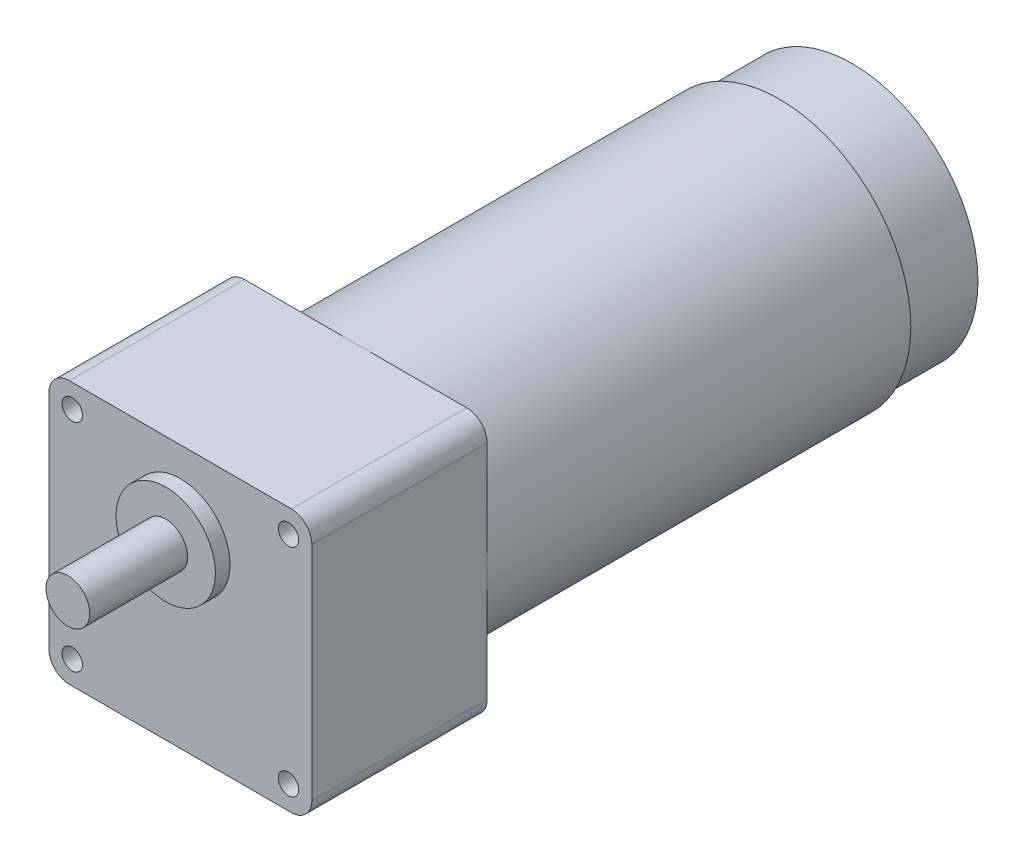
ISO-10303-21;
HEADER;
FILE_DESCRIPTION(('STEP AP214'),'2;1');
FILE_NAME('part.step','',(''),(''),'','','');
FILE_SCHEMA(('AUTOMOTIVE_DESIGN { 1 0 10303 214 1 1 1 1 }'));
ENDSEC;
DATA;
#1=APPLICATION_CONTEXT('core data for automotive mechanical design processes');
#2=APPLICATION_PROTOCOL_DEFINITION('international standard','automotive_design',2000,#1);
#3=PRODUCT_CONTEXT('',#1,'mechanical');
#4=PRODUCT('Part','Part','',(#3));
#5=PRODUCT_RELATED_PRODUCT_CATEGORY('part','',(#4));
#6=PRODUCT_DEFINITION_FORMATION('','',#4);
#7=PRODUCT_DEFINITION_CONTEXT('part definition',#1,'design');
#8=PRODUCT_DEFINITION('design','',#6,#7);
#9=PRODUCT_DEFINITION_SHAPE('','',#8);
#10=(LENGTH_UNIT() NAMED_UNIT(*) SI_UNIT(.MILLI.,.METRE.));
#11=(NAMED_UNIT(*) PLANE_ANGLE_UNIT() SI_UNIT($,.RADIAN.));
#12=(NAMED_UNIT(*) SI_UNIT($,.STERADIAN.) SOLID_ANGLE_UNIT());
#13=UNCERTAINTY_MEASURE_WITH_UNIT(LENGTH_MEASURE(1.E-05),#10,'distance_accuracy_value','');
#14=(GEOMETRIC_REPRESENTATION_CONTEXT(3) GLOBAL_UNCERTAINTY_ASSIGNED_CONTEXT((#13)) GLOBAL_UNIT_ASSIGNED_CONTEXT((#10,
#11,#12)) REPRESENTATION_CONTEXT('',''));
#15=CARTESIAN_POINT('',(0.,0.,0.));
#16=DIRECTION('',(0.,0.,1.));
#17=DIRECTION('',(1.,0.,0.));
#18=AXIS2_PLACEMENT_3D('',#15,#16,#17);
#19=CARTESIAN_POINT('',(0.,0.,-170.));
#20=DIRECTION('',(0.,0.,1.));
#21=DIRECTION('',(1.,0.,0.));
#22=AXIS2_PLACEMENT_3D('',#19,#20,#21);
#23=CYLINDRICAL_SURFACE('',#22,45.);
#24=CARTESIAN_POINT('',(0.,0.,0.));
#25=DIRECTION('',(0.,0.,-1.));
#26=DIRECTION('',(-1.,0.,0.));
#27=AXIS2_PLACEMENT_3D('',#24,#25,#26);
#28=CIRCLE('',#27,45.);
#29=CARTESIAN_POINT('',(-45.,0.,0.));
#30=VERTEX_POINT('',#29);
#31=CARTESIAN_POINT('',(0.,45.,0.));
#32=VERTEX_POINT('',#31);
#33=EDGE_CURVE('E129',#30,#32,#28,.T.);
#34=ORIENTED_EDGE('',*,*,#33,.T.);
#35=CARTESIAN_POINT('',(45.,0.,0.));
#36=VERTEX_POINT('',#35);
#37=EDGE_CURVE('E138',#32,#36,#28,.T.);
#38=ORIENTED_EDGE('',*,*,#37,.T.);
#39=CARTESIAN_POINT('',(0.,-45.,0.));
#40=VERTEX_POINT('',#39);
#41=EDGE_CURVE('E142',#36,#40,#28,.T.);
#42=ORIENTED_EDGE('',*,*,#41,.T.);
#43=EDGE_CURVE('E124',#40,#30,#28,.T.);
#44=ORIENTED_EDGE('',*,*,#43,.T.);
#45=EDGE_LOOP('',(#34,#38,#42,#44));
#46=FACE_BOUND('',#45,.T.);
#47=CARTESIAN_POINT('',(0.,0.,-145.));
#48=DIRECTION('',(0.,0.,-1.));
#49=DIRECTION('',(-1.,0.,0.));
#50=AXIS2_PLACEMENT_3D('',#47,#48,#49);
#51=CIRCLE('',#50,45.);
#52=CARTESIAN_POINT('',(-45.,0.,-145.));
#53=VERTEX_POINT('',#52);
#54=EDGE_CURVE('E494',#53,#53,#51,.T.);
#55=ORIENTED_EDGE('',*,*,#54,.F.);
#56=EDGE_LOOP('',(#55));
#57=FACE_BOUND('',#56,.T.);
#58=ADVANCED_FACE('F35',(#46,#57),#23,.T.);
#59=CARTESIAN_POINT('',(0.,0.,0.));
#60=DIRECTION('',(0.,0.,1.));
#61=DIRECTION('',(1.,0.,0.));
#62=AXIS2_PLACEMENT_3D('',#59,#60,#61);
#63=PLANE('',#62);
#64=CARTESIAN_POINT('',(-37.,37.,0.));
#65=DIRECTION('',(0.,0.,1.));
#66=DIRECTION('',(1.,0.,0.));
#67=AXIS2_PLACEMENT_3D('',#64,#65,#66);
#68=CIRCLE('',#67,3.5);
#69=CARTESIAN_POINT('',(-33.5,37.,0.));
#70=VERTEX_POINT('',#69);
#71=EDGE_CURVE('E520',#70,#70,#68,.F.);
#72=ORIENTED_EDGE('',*,*,#71,.F.);
#73=EDGE_LOOP('',(#72));
#74=FACE_BOUND('',#73,.T.);
#75=DIRECTION('',(0.,-1.,0.));
#76=VECTOR('',#75,1.);
#77=CARTESIAN_POINT('',(-45.,45.,0.));
#78=LINE('',#77,#76);
#79=CARTESIAN_POINT('',(-45.,38.,0.));
#80=VERTEX_POINT('',#79);
#81=EDGE_CURVE('E111',#80,#30,#78,.T.);
#82=ORIENTED_EDGE('',*,*,#81,.F.);
#83=CARTESIAN_POINT('',(-38.,38.,0.));
#84=DIRECTION('',(0.,0.,1.));
#85=DIRECTION('',(1.,0.,0.));
#86=AXIS2_PLACEMENT_3D('',#83,#84,#85);
#87=CIRCLE('',#86,7.);
#88=CARTESIAN_POINT('',(-38.,45.,0.));
#89=VERTEX_POINT('',#88);
#90=EDGE_CURVE('E11',#80,#89,#87,.F.);
#91=ORIENTED_EDGE('',*,*,#90,.T.);
#92=DIRECTION('',(-1.,0.,0.));
#93=VECTOR('',#92,1.);
#94=CARTESIAN_POINT('',(-45.,45.,0.));
#95=LINE('',#94,#93);
#96=EDGE_CURVE('E132',#32,#89,#95,.T.);
#97=ORIENTED_EDGE('',*,*,#96,.F.);
#98=ORIENTED_EDGE('',*,*,#33,.F.);
#99=EDGE_LOOP('',(#82,#91,#97,#98));
#100=FACE_BOUND('',#99,.T.);
#101=ADVANCED_FACE('F130',(#74,#100),#63,.F.);
#102=CARTESIAN_POINT('',(37.,37.0000000000021,0.));
#103=DIRECTION('',(0.,0.,1.));
#104=DIRECTION('',(1.,0.,0.));
#105=AXIS2_PLACEMENT_3D('',#102,#103,#104);
#106=CIRCLE('',#105,3.5);
#107=CARTESIAN_POINT('',(40.5,37.0000000000021,0.));
#108=VERTEX_POINT('',#107);
#109=EDGE_CURVE('E503',#108,#108,#106,.F.);
#110=ORIENTED_EDGE('',*,*,#109,.F.);
#111=EDGE_LOOP('',(#110));
#112=FACE_BOUND('',#111,.T.);
#113=CARTESIAN_POINT('',(37.9999999999999,45.,0.));
#114=VERTEX_POINT('',#113);
#115=EDGE_CURVE('E126',#114,#32,#95,.T.);
#116=ORIENTED_EDGE('',*,*,#115,.F.);
#117=CARTESIAN_POINT('',(38.,38.,0.));
#118=DIRECTION('',(0.,0.,1.));
#119=DIRECTION('',(1.,0.,0.));
#120=AXIS2_PLACEMENT_3D('',#117,#118,#119);
#121=CIRCLE('',#120,7.);
#122=CARTESIAN_POINT('',(45.,38.,0.));
#123=VERTEX_POINT('',#122);
#124=EDGE_CURVE('E189',#114,#123,#121,.F.);
#125=ORIENTED_EDGE('',*,*,#124,.T.);
#126=DIRECTION('',(0.,1.,0.));
#127=VECTOR('',#126,1.);
#128=CARTESIAN_POINT('',(45.,45.,0.));
#129=LINE('',#128,#127);
#130=EDGE_CURVE('E135',#36,#123,#129,.T.);
#131=ORIENTED_EDGE('',*,*,#130,.F.);
#132=ORIENTED_EDGE('',*,*,#37,.F.);
#133=EDGE_LOOP('',(#116,#125,#131,#132));
#134=FACE_BOUND('',#133,.T.);
#135=ADVANCED_FACE('F219',(#112,#134),#63,.F.);
#136=CARTESIAN_POINT('',(37.0000000000021,-36.9999999999979,0.));
#137=DIRECTION('',(0.,0.,1.));
#138=DIRECTION('',(1.,0.,0.));
#139=AXIS2_PLACEMENT_3D('',#136,#137,#138);
#140=CIRCLE('',#139,3.5);
#141=CARTESIAN_POINT('',(40.5000000000021,-36.9999999999979,0.));
#142=VERTEX_POINT('',#141);
#143=EDGE_CURVE('E504',#142,#142,#140,.F.);
#144=ORIENTED_EDGE('',*,*,#143,.F.);
#145=EDGE_LOOP('',(#144));
#146=FACE_BOUND('',#145,.T.);
#147=CARTESIAN_POINT('',(45.,-38.,0.));
#148=VERTEX_POINT('',#147);
#149=EDGE_CURVE('E160',#148,#36,#129,.T.);
#150=ORIENTED_EDGE('',*,*,#149,.F.);
#151=CARTESIAN_POINT('',(38.,-38.,0.));
#152=DIRECTION('',(0.,0.,1.));
#153=DIRECTION('',(1.,0.,0.));
#154=AXIS2_PLACEMENT_3D('',#151,#152,#153);
#155=CIRCLE('',#154,7.);
#156=CARTESIAN_POINT('',(38.,-45.,0.));
#157=VERTEX_POINT('',#156);
#158=EDGE_CURVE('E169',#148,#157,#155,.F.);
#159=ORIENTED_EDGE('',*,*,#158,.T.);
#160=DIRECTION('',(1.,0.,0.));
#161=VECTOR('',#160,1.);
#162=CARTESIAN_POINT('',(-45.,-45.,0.));
#163=LINE('',#162,#161);
#164=EDGE_CURVE('E119',#40,#157,#163,.T.);
#165=ORIENTED_EDGE('',*,*,#164,.F.);
#166=ORIENTED_EDGE('',*,*,#41,.F.);
#167=EDGE_LOOP('',(#150,#159,#165,#166));
#168=FACE_BOUND('',#167,.T.);
#169=ADVANCED_FACE('F214',(#146,#168),#63,.F.);
#170=CARTESIAN_POINT('',(45.,45.,60.));
#171=DIRECTION('',(-1.,0.,0.));
#172=DIRECTION('',(0.,-1.,0.));
#173=AXIS2_PLACEMENT_3D('',#170,#171,#172);
#174=PLANE('',#173);
#175=DIRECTION('',(0.,1.,0.));
#176=VECTOR('',#175,1.);
#177=CARTESIAN_POINT('',(45.,45.,60.));
#178=LINE('',#177,#176);
#179=CARTESIAN_POINT('',(45.,-38.,60.));
#180=VERTEX_POINT('',#179);
#181=CARTESIAN_POINT('',(45.,38.,60.));
#182=VERTEX_POINT('',#181);
#183=EDGE_CURVE('E151',#180,#182,#178,.T.);
#184=ORIENTED_EDGE('',*,*,#183,.F.);
#185=DIRECTION('',(0.,0.,-1.));
#186=VECTOR('',#185,1.);
#187=CARTESIAN_POINT('',(45.,-38.,60.));
#188=LINE('',#187,#186);
#189=EDGE_CURVE('E166',#180,#148,#188,.T.);
#190=ORIENTED_EDGE('',*,*,#189,.T.);
#191=ORIENTED_EDGE('',*,*,#149,.T.);
#192=ORIENTED_EDGE('',*,*,#130,.T.);
#193=DIRECTION('',(0.,0.,-1.));
#194=VECTOR('',#193,1.);
#195=CARTESIAN_POINT('',(45.,38.,60.));
#196=LINE('',#195,#194);
#197=EDGE_CURVE('E164',#123,#182,#196,.F.);
#198=ORIENTED_EDGE('',*,*,#197,.T.);
#199=EDGE_LOOP('',(#184,#190,#191,#192,#198));
#200=FACE_BOUND('',#199,.T.);
#201=ADVANCED_FACE('F211',(#200),#174,.F.);
#202=CARTESIAN_POINT('',(-45.,45.,60.));
#203=DIRECTION('',(0.,-1.,0.));
#204=DIRECTION('',(0.,0.,-1.));
#205=AXIS2_PLACEMENT_3D('',#202,#203,#204);
#206=PLANE('',#205);
#207=DIRECTION('',(-1.,0.,0.));
#208=VECTOR('',#207,1.);
#209=CARTESIAN_POINT('',(-45.,45.,60.));
#210=LINE('',#209,#208);
#211=CARTESIAN_POINT('',(37.9999999999999,45.,60.));
#212=VERTEX_POINT('',#211);
#213=CARTESIAN_POINT('',(-38.,45.,60.));
#214=VERTEX_POINT('',#213);
#215=EDGE_CURVE('E154',#212,#214,#210,.T.);
#216=ORIENTED_EDGE('',*,*,#215,.F.);
#217=DIRECTION('',(0.,0.,-1.));
#218=VECTOR('',#217,1.);
#219=CARTESIAN_POINT('',(38.,45.,60.));
#220=LINE('',#219,#218);
#221=EDGE_CURVE('E186',#212,#114,#220,.T.);
#222=ORIENTED_EDGE('',*,*,#221,.T.);
#223=ORIENTED_EDGE('',*,*,#115,.T.);
#224=ORIENTED_EDGE('',*,*,#96,.T.);
#225=DIRECTION('',(0.,0.,-1.));
#226=VECTOR('',#225,1.);
#227=CARTESIAN_POINT('',(-38.,45.,60.));
#228=LINE('',#227,#226);
#229=EDGE_CURVE('E184',#89,#214,#228,.F.);
#230=ORIENTED_EDGE('',*,*,#229,.T.);
#231=EDGE_LOOP('',(#216,#222,#223,#224,#230));
#232=FACE_BOUND('',#231,.T.);
#233=ADVANCED_FACE('F227',(#232),#206,.F.);
#234=CARTESIAN_POINT('',(-45.,45.,60.));
#235=DIRECTION('',(1.,0.,0.));
#236=DIRECTION('',(0.,1.,0.));
#237=AXIS2_PLACEMENT_3D('',#234,#235,#236);
#238=PLANE('',#237);
#239=CARTESIAN_POINT('',(-45.,-38.,0.));
#240=VERTEX_POINT('',#239);
#241=EDGE_CURVE('E113',#30,#240,#78,.T.);
#242=ORIENTED_EDGE('',*,*,#241,.T.);
#243=DIRECTION('',(0.,0.,-1.));
#244=VECTOR('',#243,1.);
#245=CARTESIAN_POINT('',(-45.,-38.,60.));
#246=LINE('',#245,#244);
#247=CARTESIAN_POINT('',(-45.,-38.,60.));
#248=VERTEX_POINT('',#247);
#249=EDGE_CURVE('E43',#240,#248,#246,.F.);
#250=ORIENTED_EDGE('',*,*,#249,.T.);
#251=DIRECTION('',(0.,-1.,0.));
#252=VECTOR('',#251,1.);
#253=CARTESIAN_POINT('',(-45.,45.,60.));
#254=LINE('',#253,#252);
#255=CARTESIAN_POINT('',(-45.,38.,60.));
#256=VERTEX_POINT('',#255);
#257=EDGE_CURVE('E145',#256,#248,#254,.T.);
#258=ORIENTED_EDGE('',*,*,#257,.F.);
#259=DIRECTION('',(0.,0.,-1.));
#260=VECTOR('',#259,1.);
#261=CARTESIAN_POINT('',(-45.,38.,60.));
#262=LINE('',#261,#260);
#263=EDGE_CURVE('E116',#256,#80,#262,.T.);
#264=ORIENTED_EDGE('',*,*,#263,.T.);
#265=ORIENTED_EDGE('',*,*,#81,.T.);
#266=EDGE_LOOP('',(#242,#250,#258,#264,#265));
#267=FACE_BOUND('',#266,.T.);
#268=ADVANCED_FACE('F112',(#267),#238,.F.);
#269=CARTESIAN_POINT('',(-45.,-45.,60.));
#270=DIRECTION('',(0.,1.,0.));
#271=DIRECTION('',(0.,0.,1.));
#272=AXIS2_PLACEMENT_3D('',#269,#270,#271);
#273=PLANE('',#272);
#274=ORIENTED_EDGE('',*,*,#164,.T.);
#275=DIRECTION('',(0.,0.,-1.));
#276=VECTOR('',#275,1.);
#277=CARTESIAN_POINT('',(38.,-45.,60.));
#278=LINE('',#277,#276);
#279=CARTESIAN_POINT('',(38.,-45.,60.));
#280=VERTEX_POINT('',#279);
#281=EDGE_CURVE('E174',#157,#280,#278,.F.);
#282=ORIENTED_EDGE('',*,*,#281,.T.);
#283=DIRECTION('',(1.,0.,0.));
#284=VECTOR('',#283,1.);
#285=CARTESIAN_POINT('',(-45.,-45.,60.));
#286=LINE('',#285,#284);
#287=CARTESIAN_POINT('',(-38.,-45.,60.));
#288=VERTEX_POINT('',#287);
#289=EDGE_CURVE('E143',#288,#280,#286,.T.);
#290=ORIENTED_EDGE('',*,*,#289,.F.);
#291=DIRECTION('',(0.,0.,-1.));
#292=VECTOR('',#291,1.);
#293=CARTESIAN_POINT('',(-38.,-45.,60.));
#294=LINE('',#293,#292);
#295=CARTESIAN_POINT('',(-38.,-45.,0.));
#296=VERTEX_POINT('',#295);
#297=EDGE_CURVE('E171',#288,#296,#294,.T.);
#298=ORIENTED_EDGE('',*,*,#297,.T.);
#299=EDGE_CURVE('E155',#296,#40,#163,.T.);
#300=ORIENTED_EDGE('',*,*,#299,.T.);
#301=EDGE_LOOP('',(#274,#282,#290,#298,#300));
#302=FACE_BOUND('',#301,.T.);
#303=ADVANCED_FACE('F202',(#302),#273,.F.);
#304=CARTESIAN_POINT('',(0.,0.,60.));
#305=DIRECTION('',(0.,0.,1.));
#306=DIRECTION('',(1.,0.,0.));
#307=AXIS2_PLACEMENT_3D('',#304,#305,#306);
#308=PLANE('',#307);
#309=CARTESIAN_POINT('',(37.,37.0000000000021,60.));
#310=DIRECTION('',(0.,0.,1.));
#311=DIRECTION('',(1.,0.,0.));
#312=AXIS2_PLACEMENT_3D('',#309,#310,#311);
#313=CIRCLE('',#312,3.5);
#314=CARTESIAN_POINT('',(40.5,37.0000000000021,60.));
#315=VERTEX_POINT('',#314);
#316=EDGE_CURVE('E500',#315,#315,#313,.T.);
#317=ORIENTED_EDGE('',*,*,#316,.F.);
#318=EDGE_LOOP('',(#317));
#319=FACE_BOUND('',#318,.T.);
#320=CARTESIAN_POINT('',(37.0000000000021,-36.9999999999979,60.));
#321=DIRECTION('',(0.,0.,1.));
#322=DIRECTION('',(1.,0.,0.));
#323=AXIS2_PLACEMENT_3D('',#320,#321,#322);
#324=CIRCLE('',#323,3.5);
#325=CARTESIAN_POINT('',(40.5000000000021,-36.9999999999979,60.));
#326=VERTEX_POINT('',#325);
#327=EDGE_CURVE('E508',#326,#326,#324,.T.);
#328=ORIENTED_EDGE('',*,*,#327,.F.);
#329=EDGE_LOOP('',(#328));
#330=FACE_BOUND('',#329,.T.);
#331=CARTESIAN_POINT('',(-36.9999999999979,-37.,60.));
#332=DIRECTION('',(0.,0.,1.));
#333=DIRECTION('',(1.,0.,0.));
#334=AXIS2_PLACEMENT_3D('',#331,#332,#333);
#335=CIRCLE('',#334,3.5);
#336=CARTESIAN_POINT('',(-33.4999999999979,-37.,60.));
#337=VERTEX_POINT('',#336);
#338=EDGE_CURVE('E499',#337,#337,#335,.T.);
#339=ORIENTED_EDGE('',*,*,#338,.F.);
#340=EDGE_LOOP('',(#339));
#341=FACE_BOUND('',#340,.T.);
#342=CARTESIAN_POINT('',(-37.,37.,60.));
#343=DIRECTION('',(0.,0.,1.));
#344=DIRECTION('',(1.,0.,0.));
#345=AXIS2_PLACEMENT_3D('',#342,#343,#344);
#346=CIRCLE('',#345,3.5);
#347=CARTESIAN_POINT('',(-33.5,37.,60.));
#348=VERTEX_POINT('',#347);
#349=EDGE_CURVE('E507',#348,#348,#346,.T.);
#350=ORIENTED_EDGE('',*,*,#349,.F.);
#351=EDGE_LOOP('',(#350));
#352=FACE_BOUND('',#351,.T.);
#353=CARTESIAN_POINT('',(0.,18.,60.));
#354=DIRECTION('',(0.,0.,1.));
#355=DIRECTION('',(1.,0.,0.));
#356=AXIS2_PLACEMENT_3D('',#353,#354,#355);
#357=CIRCLE('',#356,17.);
#358=CARTESIAN_POINT('',(17.,18.,60.));
#359=VERTEX_POINT('',#358);
#360=EDGE_CURVE('E149',#359,#359,#357,.T.);
#361=ORIENTED_EDGE('',*,*,#360,.F.);
#362=EDGE_LOOP('',(#361));
#363=FACE_BOUND('',#362,.T.);
#364=ORIENTED_EDGE('',*,*,#289,.T.);
#365=CARTESIAN_POINT('',(38.,-38.,60.));
#366=DIRECTION('',(0.,0.,1.));
#367=DIRECTION('',(1.,0.,0.));
#368=AXIS2_PLACEMENT_3D('',#365,#366,#367);
#369=CIRCLE('',#368,7.);
#370=EDGE_CURVE('E182',#280,#180,#369,.T.);
#371=ORIENTED_EDGE('',*,*,#370,.T.);
#372=ORIENTED_EDGE('',*,*,#183,.T.);
#373=CARTESIAN_POINT('',(38.,38.,60.));
#374=DIRECTION('',(0.,0.,1.));
#375=DIRECTION('',(1.,0.,0.));
#376=AXIS2_PLACEMENT_3D('',#373,#374,#375);
#377=CIRCLE('',#376,7.);
#378=EDGE_CURVE('E180',#182,#212,#377,.T.);
#379=ORIENTED_EDGE('',*,*,#378,.T.);
#380=ORIENTED_EDGE('',*,*,#215,.T.);
#381=CARTESIAN_POINT('',(-38.,38.,60.));
#382=DIRECTION('',(0.,0.,1.));
#383=DIRECTION('',(1.,0.,0.));
#384=AXIS2_PLACEMENT_3D('',#381,#382,#383);
#385=CIRCLE('',#384,7.);
#386=EDGE_CURVE('E176',#214,#256,#385,.T.);
#387=ORIENTED_EDGE('',*,*,#386,.T.);
#388=ORIENTED_EDGE('',*,*,#257,.T.);
#389=CARTESIAN_POINT('',(-38.,-38.,60.));
#390=DIRECTION('',(0.,0.,1.));
#391=DIRECTION('',(1.,0.,0.));
#392=AXIS2_PLACEMENT_3D('',#389,#390,#391);
#393=CIRCLE('',#392,7.);
#394=EDGE_CURVE('E178',#248,#288,#393,.T.);
#395=ORIENTED_EDGE('',*,*,#394,.T.);
#396=EDGE_LOOP('',(#364,#371,#372,#379,#380,#387,#388,#395));
#397=FACE_BOUND('',#396,.T.);
#398=ADVANCED_FACE('F195',(#319,#330,#341,#352,#363,#397),#308,.T.);
#399=CARTESIAN_POINT('',(-36.9999999999979,-37.,0.));
#400=DIRECTION('',(0.,0.,1.));
#401=DIRECTION('',(1.,0.,0.));
#402=AXIS2_PLACEMENT_3D('',#399,#400,#401);
#403=CIRCLE('',#402,3.5);
#404=CARTESIAN_POINT('',(-33.4999999999979,-37.,0.));
#405=VERTEX_POINT('',#404);
#406=EDGE_CURVE('E511',#405,#405,#403,.F.);
#407=ORIENTED_EDGE('',*,*,#406,.F.);
#408=EDGE_LOOP('',(#407));
#409=FACE_BOUND('',#408,.T.);
#410=ORIENTED_EDGE('',*,*,#299,.F.);
#411=CARTESIAN_POINT('',(-38.,-38.,0.));
#412=DIRECTION('',(0.,0.,1.));
#413=DIRECTION('',(1.,0.,0.));
#414=AXIS2_PLACEMENT_3D('',#411,#412,#413);
#415=CIRCLE('',#414,7.);
#416=EDGE_CURVE('E56',#296,#240,#415,.F.);
#417=ORIENTED_EDGE('',*,*,#416,.T.);
#418=ORIENTED_EDGE('',*,*,#241,.F.);
#419=ORIENTED_EDGE('',*,*,#43,.F.);
#420=EDGE_LOOP('',(#410,#417,#418,#419));
#421=FACE_BOUND('',#420,.T.);
#422=ADVANCED_FACE('F122',(#409,#421),#63,.F.);
#423=CARTESIAN_POINT('',(0.,18.,65.));
#424=DIRECTION('',(0.,0.,-1.));
#425=DIRECTION('',(-1.,0.,0.));
#426=AXIS2_PLACEMENT_3D('',#423,#424,#425);
#427=CYLINDRICAL_SURFACE('',#426,17.);
#428=CARTESIAN_POINT('',(0.,18.,65.));
#429=DIRECTION('',(0.,0.,1.));
#430=DIRECTION('',(1.,0.,0.));
#431=AXIS2_PLACEMENT_3D('',#428,#429,#430);
#432=CIRCLE('',#431,17.);
#433=CARTESIAN_POINT('',(17.,18.,65.));
#434=VERTEX_POINT('',#433);
#435=EDGE_CURVE('E136',#434,#434,#432,.T.);
#436=ORIENTED_EDGE('',*,*,#435,.F.);
#437=EDGE_LOOP('',(#436));
#438=FACE_BOUND('',#437,.T.);
#439=ORIENTED_EDGE('',*,*,#360,.T.);
#440=EDGE_LOOP('',(#439));
#441=FACE_BOUND('',#440,.T.);
#442=ADVANCED_FACE('F253',(#438,#441),#427,.T.);
#443=CARTESIAN_POINT('',(0.,18.,65.));
#444=DIRECTION('',(0.,0.,1.));
#445=DIRECTION('',(1.,0.,0.));
#446=AXIS2_PLACEMENT_3D('',#443,#444,#445);
#447=PLANE('',#446);
#448=CARTESIAN_POINT('',(0.,18.,65.));
#449=DIRECTION('',(0.,0.,1.));
#450=DIRECTION('',(1.,0.,0.));
#451=AXIS2_PLACEMENT_3D('',#448,#449,#450);
#452=CIRCLE('',#451,7.5);
#453=CARTESIAN_POINT('',(7.5,18.,65.));
#454=VERTEX_POINT('',#453);
#455=EDGE_CURVE('E523',#454,#454,#452,.T.);
#456=ORIENTED_EDGE('',*,*,#455,.F.);
#457=EDGE_LOOP('',(#456));
#458=FACE_BOUND('',#457,.T.);
#459=ORIENTED_EDGE('',*,*,#435,.T.);
#460=EDGE_LOOP('',(#459));
#461=FACE_BOUND('',#460,.T.);
#462=ADVANCED_FACE('F387',(#458,#461),#447,.T.);
#463=CARTESIAN_POINT('',(0.,18.,98.5));
#464=DIRECTION('',(0.,0.,-1.));
#465=DIRECTION('',(-1.,0.,0.));
#466=AXIS2_PLACEMENT_3D('',#463,#464,#465);
#467=CYLINDRICAL_SURFACE('',#466,7.5);
#468=CARTESIAN_POINT('',(0.,18.,98.5));
#469=DIRECTION('',(0.,0.,1.));
#470=DIRECTION('',(1.,0.,0.));
#471=AXIS2_PLACEMENT_3D('',#468,#469,#470);
#472=CIRCLE('',#471,7.5);
#473=CARTESIAN_POINT('',(7.5,18.,98.5));
#474=VERTEX_POINT('',#473);
#475=EDGE_CURVE('E524',#474,#474,#472,.T.);
#476=ORIENTED_EDGE('',*,*,#475,.F.);
#477=EDGE_LOOP('',(#476));
#478=FACE_BOUND('',#477,.T.);
#479=ORIENTED_EDGE('',*,*,#455,.T.);
#480=EDGE_LOOP('',(#479));
#481=FACE_BOUND('',#480,.T.);
#482=ADVANCED_FACE('F377',(#478,#481),#467,.T.);
#483=CARTESIAN_POINT('',(0.,18.,98.5));
#484=DIRECTION('',(0.,0.,1.));
#485=DIRECTION('',(1.,0.,0.));
#486=AXIS2_PLACEMENT_3D('',#483,#484,#485);
#487=PLANE('',#486);
#488=ORIENTED_EDGE('',*,*,#475,.T.);
#489=EDGE_LOOP('',(#488));
#490=FACE_BOUND('',#489,.T.);
#491=ADVANCED_FACE('F367',(#490),#487,.T.);
#492=CARTESIAN_POINT('',(-37.,37.,-170.001));
#493=DIRECTION('',(0.,0.,1.));
#494=DIRECTION('',(1.,0.,0.));
#495=AXIS2_PLACEMENT_3D('',#492,#493,#494);
#496=CYLINDRICAL_SURFACE('',#495,3.5);
#497=ORIENTED_EDGE('',*,*,#349,.T.);
#498=EDGE_LOOP('',(#497));
#499=FACE_BOUND('',#498,.T.);
#500=ORIENTED_EDGE('',*,*,#71,.T.);
#501=EDGE_LOOP('',(#500));
#502=FACE_BOUND('',#501,.T.);
#503=ADVANCED_FACE('F357',(#499,#502),#496,.F.);
#504=CARTESIAN_POINT('',(-36.9999999999979,-37.,-170.001));
#505=DIRECTION('',(0.,0.,1.));
#506=DIRECTION('',(1.,0.,0.));
#507=AXIS2_PLACEMENT_3D('',#504,#505,#506);
#508=CYLINDRICAL_SURFACE('',#507,3.5);
#509=ORIENTED_EDGE('',*,*,#338,.T.);
#510=EDGE_LOOP('',(#509));
#511=FACE_BOUND('',#510,.T.);
#512=ORIENTED_EDGE('',*,*,#406,.T.);
#513=EDGE_LOOP('',(#512));
#514=FACE_BOUND('',#513,.T.);
#515=ADVANCED_FACE('F347',(#511,#514),#508,.F.);
#516=CARTESIAN_POINT('',(37.0000000000021,-36.9999999999979,-170.001));
#517=DIRECTION('',(0.,0.,1.));
#518=DIRECTION('',(1.,0.,0.));
#519=AXIS2_PLACEMENT_3D('',#516,#517,#518);
#520=CYLINDRICAL_SURFACE('',#519,3.5);
#521=ORIENTED_EDGE('',*,*,#327,.T.);
#522=EDGE_LOOP('',(#521));
#523=FACE_BOUND('',#522,.T.);
#524=ORIENTED_EDGE('',*,*,#143,.T.);
#525=EDGE_LOOP('',(#524));
#526=FACE_BOUND('',#525,.T.);
#527=ADVANCED_FACE('F334',(#523,#526),#520,.F.);
#528=CARTESIAN_POINT('',(37.,37.0000000000021,-170.001));
#529=DIRECTION('',(0.,0.,1.));
#530=DIRECTION('',(1.,0.,0.));
#531=AXIS2_PLACEMENT_3D('',#528,#529,#530);
#532=CYLINDRICAL_SURFACE('',#531,3.5);
#533=ORIENTED_EDGE('',*,*,#316,.T.);
#534=EDGE_LOOP('',(#533));
#535=FACE_BOUND('',#534,.T.);
#536=ORIENTED_EDGE('',*,*,#109,.T.);
#537=EDGE_LOOP('',(#536));
#538=FACE_BOUND('',#537,.T.);
#539=ADVANCED_FACE('F265',(#535,#538),#532,.F.);
#540=CARTESIAN_POINT('',(38.,-38.,60.));
#541=DIRECTION('',(0.,0.,-1.));
#542=DIRECTION('',(-1.,0.,0.));
#543=AXIS2_PLACEMENT_3D('',#540,#541,#542);
#544=CYLINDRICAL_SURFACE('',#543,7.);
#545=ORIENTED_EDGE('',*,*,#370,.F.);
#546=ORIENTED_EDGE('',*,*,#281,.F.);
#547=ORIENTED_EDGE('',*,*,#158,.F.);
#548=ORIENTED_EDGE('',*,*,#189,.F.);
#549=EDGE_LOOP('',(#545,#546,#547,#548));
#550=FACE_BOUND('',#549,.T.);
#551=ADVANCED_FACE('F208',(#550),#544,.T.);
#552=CARTESIAN_POINT('',(38.,38.,60.));
#553=DIRECTION('',(0.,0.,-1.));
#554=DIRECTION('',(-1.,0.,0.));
#555=AXIS2_PLACEMENT_3D('',#552,#553,#554);
#556=CYLINDRICAL_SURFACE('',#555,7.);
#557=ORIENTED_EDGE('',*,*,#378,.F.);
#558=ORIENTED_EDGE('',*,*,#197,.F.);
#559=ORIENTED_EDGE('',*,*,#124,.F.);
#560=ORIENTED_EDGE('',*,*,#221,.F.);
#561=EDGE_LOOP('',(#557,#558,#559,#560));
#562=FACE_BOUND('',#561,.T.);
#563=ADVANCED_FACE('F223',(#562),#556,.T.);
#564=CARTESIAN_POINT('',(-38.,-38.,60.));
#565=DIRECTION('',(0.,0.,-1.));
#566=DIRECTION('',(-1.,0.,0.));
#567=AXIS2_PLACEMENT_3D('',#564,#565,#566);
#568=CYLINDRICAL_SURFACE('',#567,7.);
#569=ORIENTED_EDGE('',*,*,#394,.F.);
#570=ORIENTED_EDGE('',*,*,#249,.F.);
#571=ORIENTED_EDGE('',*,*,#416,.F.);
#572=ORIENTED_EDGE('',*,*,#297,.F.);
#573=EDGE_LOOP('',(#569,#570,#571,#572));
#574=FACE_BOUND('',#573,.T.);
#575=ADVANCED_FACE('F199',(#574),#568,.T.);
#576=CARTESIAN_POINT('',(-38.,38.,60.));
#577=DIRECTION('',(0.,0.,-1.));
#578=DIRECTION('',(-1.,0.,0.));
#579=AXIS2_PLACEMENT_3D('',#576,#577,#578);
#580=CYLINDRICAL_SURFACE('',#579,7.);
#581=ORIENTED_EDGE('',*,*,#386,.F.);
#582=ORIENTED_EDGE('',*,*,#229,.F.);
#583=ORIENTED_EDGE('',*,*,#90,.F.);
#584=ORIENTED_EDGE('',*,*,#263,.F.);
#585=EDGE_LOOP('',(#581,#582,#583,#584));
#586=FACE_BOUND('',#585,.T.);
#587=ADVANCED_FACE('F37',(#586),#580,.T.);
#588=CARTESIAN_POINT('',(0.,0.,-145.));
#589=DIRECTION('',(0.,0.,-1.));
#590=DIRECTION('',(-1.,0.,0.));
#591=AXIS2_PLACEMENT_3D('',#588,#589,#590);
#592=PLANE('',#591);
#593=CARTESIAN_POINT('',(0.,0.,-145.));
#594=DIRECTION('',(0.,0.,-1.));
#595=DIRECTION('',(-1.,0.,0.));
#596=AXIS2_PLACEMENT_3D('',#593,#594,#595);
#597=CIRCLE('',#596,43.);
#598=CARTESIAN_POINT('',(-43.,0.,-145.));
#599=VERTEX_POINT('',#598);
#600=EDGE_CURVE('E489',#599,#599,#597,.T.);
#601=ORIENTED_EDGE('',*,*,#600,.F.);
#602=EDGE_LOOP('',(#601));
#603=FACE_BOUND('',#602,.T.);
#604=ORIENTED_EDGE('',*,*,#54,.T.);
#605=EDGE_LOOP('',(#604));
#606=FACE_BOUND('',#605,.T.);
#607=ADVANCED_FACE('F229',(#603,#606),#592,.T.);
#608=CARTESIAN_POINT('',(0.,0.,-145.));
#609=DIRECTION('',(0.,0.,-1.));
#610=DIRECTION('',(-1.,0.,0.));
#611=AXIS2_PLACEMENT_3D('',#608,#609,#610);
#612=CYLINDRICAL_SURFACE('',#611,43.);
#613=ORIENTED_EDGE('',*,*,#600,.T.);
#614=EDGE_LOOP('',(#613));
#615=FACE_BOUND('',#614,.T.);
#616=CARTESIAN_POINT('',(0.,0.,-170.));
#617=DIRECTION('',(0.,0.,-1.));
#618=DIRECTION('',(-1.,0.,0.));
#619=AXIS2_PLACEMENT_3D('',#616,#617,#618);
#620=CIRCLE('',#619,43.);
#621=CARTESIAN_POINT('',(-43.,0.,-170.));
#622=VERTEX_POINT('',#621);
#623=EDGE_CURVE('E492',#622,#622,#620,.T.);
#624=ORIENTED_EDGE('',*,*,#623,.F.);
#625=EDGE_LOOP('',(#624));
#626=FACE_BOUND('',#625,.T.);
#627=ADVANCED_FACE('F234',(#615,#626),#612,.T.);
#628=CARTESIAN_POINT('',(0.,0.,-170.));
#629=DIRECTION('',(0.,0.,-1.));
#630=DIRECTION('',(-1.,0.,0.));
#631=AXIS2_PLACEMENT_3D('',#628,#629,#630);
#632=PLANE('',#631);
#633=ORIENTED_EDGE('',*,*,#623,.T.);
#634=EDGE_LOOP('',(#633));
#635=FACE_BOUND('',#634,.T.);
#636=ADVANCED_FACE('F247',(#635),#632,.T.);
#637=CLOSED_SHELL('',(#58,#101,#135,#169,#201,#233,#268,#303,#398,#422,#442,#462,#482,#491,#503,
#515,#527,#539,#551,#563,#575,#587,#607,#627,#636));
#638=MANIFOLD_SOLID_BREP('B2',#637);
#639=ADVANCED_BREP_SHAPE_REPRESENTATION('',(#18,#638),#14);
#640=SHAPE_DEFINITION_REPRESENTATION(#9,#639);
ENDSEC;
END-ISO-10303-21;
